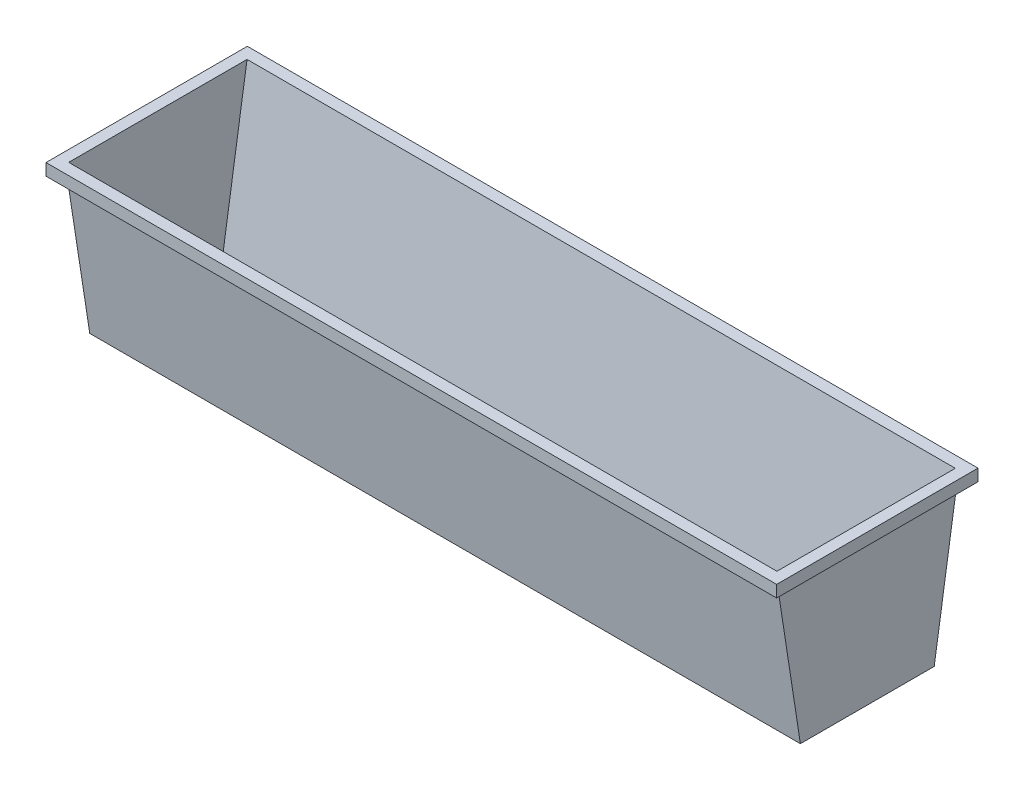
ISO-10303-21;
HEADER;
FILE_DESCRIPTION(('STEP AP214'),'2;1');
FILE_NAME('part.step','',(''),(''),'','','');
FILE_SCHEMA(('AUTOMOTIVE_DESIGN { 1 0 10303 214 1 1 1 1 }'));
ENDSEC;
DATA;
#1=APPLICATION_CONTEXT('core data for automotive mechanical design processes');
#2=APPLICATION_PROTOCOL_DEFINITION('international standard','automotive_design',2000,#1);
#3=PRODUCT_CONTEXT('',#1,'mechanical');
#4=PRODUCT('Part','Part','',(#3));
#5=PRODUCT_RELATED_PRODUCT_CATEGORY('part','',(#4));
#6=PRODUCT_DEFINITION_FORMATION('','',#4);
#7=PRODUCT_DEFINITION_CONTEXT('part definition',#1,'design');
#8=PRODUCT_DEFINITION('design','',#6,#7);
#9=PRODUCT_DEFINITION_SHAPE('','',#8);
#10=(LENGTH_UNIT() NAMED_UNIT(*) SI_UNIT(.MILLI.,.METRE.));
#11=(NAMED_UNIT(*) PLANE_ANGLE_UNIT() SI_UNIT($,.RADIAN.));
#12=(NAMED_UNIT(*) SI_UNIT($,.STERADIAN.) SOLID_ANGLE_UNIT());
#13=UNCERTAINTY_MEASURE_WITH_UNIT(LENGTH_MEASURE(1.E-05),#10,'distance_accuracy_value','');
#14=(GEOMETRIC_REPRESENTATION_CONTEXT(3) GLOBAL_UNCERTAINTY_ASSIGNED_CONTEXT((#13)) GLOBAL_UNIT_ASSIGNED_CONTEXT((#10,
#11,#12)) REPRESENTATION_CONTEXT('',''));
#15=CARTESIAN_POINT('',(0.,0.,0.));
#16=DIRECTION('',(0.,0.,1.));
#17=DIRECTION('',(1.,0.,0.));
#18=AXIS2_PLACEMENT_3D('',#15,#16,#17);
#19=CARTESIAN_POINT('',(0.,135.,0.));
#20=DIRECTION('',(0.,1.,0.));
#21=DIRECTION('',(0.,0.,1.));
#22=AXIS2_PLACEMENT_3D('',#19,#20,#21);
#23=PLANE('',#22);
#24=DIRECTION('',(1.,0.,0.));
#25=VECTOR('',#24,1.);
#26=CARTESIAN_POINT('',(-308.45833333,135.,28.4999999966667));
#27=LINE('',#26,#25);
#28=CARTESIAN_POINT('',(-308.45833333,135.,28.4999999966667));
#29=VERTEX_POINT('',#28);
#30=CARTESIAN_POINT('',(308.45833333,135.,28.4999999966667));
#31=VERTEX_POINT('',#30);
#32=EDGE_CURVE('E168',#29,#31,#27,.T.);
#33=ORIENTED_EDGE('',*,*,#32,.T.);
#34=DIRECTION('',(0.,0.,-1.));
#35=VECTOR('',#34,1.);
#36=CARTESIAN_POINT('',(308.45833333,135.,28.4999999966667));
#37=LINE('',#36,#35);
#38=CARTESIAN_POINT('',(308.45833333,135.,-141.499999996667));
#39=VERTEX_POINT('',#38);
#40=EDGE_CURVE('E171',#31,#39,#37,.T.);
#41=ORIENTED_EDGE('',*,*,#40,.T.);
#42=DIRECTION('',(-1.,0.,0.));
#43=VECTOR('',#42,1.);
#44=CARTESIAN_POINT('',(308.45833333,135.,-141.499999996667));
#45=LINE('',#44,#43);
#46=CARTESIAN_POINT('',(-308.45833333,135.,-141.499999996667));
#47=VERTEX_POINT('',#46);
#48=EDGE_CURVE('E174',#39,#47,#45,.T.);
#49=ORIENTED_EDGE('',*,*,#48,.T.);
#50=DIRECTION('',(0.,0.,1.));
#51=VECTOR('',#50,1.);
#52=CARTESIAN_POINT('',(-308.45833333,135.,-141.499999996667));
#53=LINE('',#52,#51);
#54=EDGE_CURVE('E176',#47,#29,#53,.T.);
#55=ORIENTED_EDGE('',*,*,#54,.T.);
#56=EDGE_LOOP('',(#33,#41,#49,#55));
#57=FACE_BOUND('',#56,.T.);
#58=DIRECTION('',(-1.,0.,0.));
#59=VECTOR('',#58,1.);
#60=CARTESIAN_POINT('',(299.,135.,-131.788872207039));
#61=LINE('',#60,#59);
#62=CARTESIAN_POINT('',(299.,135.,-131.788872207039));
#63=VERTEX_POINT('',#62);
#64=CARTESIAN_POINT('',(-299.,135.,-131.788872207039));
#65=VERTEX_POINT('',#64);
#66=EDGE_CURVE('E161',#63,#65,#61,.T.);
#67=ORIENTED_EDGE('',*,*,#66,.F.);
#68=DIRECTION('',(0.,0.,-1.));
#69=VECTOR('',#68,1.);
#70=CARTESIAN_POINT('',(299.,135.,-131.788872207039));
#71=LINE('',#70,#69);
#72=CARTESIAN_POINT('',(299.,135.,18.788872207039));
#73=VERTEX_POINT('',#72);
#74=EDGE_CURVE('E136',#73,#63,#71,.T.);
#75=ORIENTED_EDGE('',*,*,#74,.F.);
#76=DIRECTION('',(-1.,0.,0.));
#77=VECTOR('',#76,1.);
#78=CARTESIAN_POINT('',(299.,135.,18.788872207039));
#79=LINE('',#78,#77);
#80=CARTESIAN_POINT('',(-299.,135.,18.788872207039));
#81=VERTEX_POINT('',#80);
#82=EDGE_CURVE('E164',#73,#81,#79,.T.);
#83=ORIENTED_EDGE('',*,*,#82,.T.);
#84=DIRECTION('',(0.,0.,-1.));
#85=VECTOR('',#84,1.);
#86=CARTESIAN_POINT('',(-299.,135.,-131.788872207039));
#87=LINE('',#86,#85);
#88=EDGE_CURVE('E149',#81,#65,#87,.T.);
#89=ORIENTED_EDGE('',*,*,#88,.T.);
#90=EDGE_LOOP('',(#67,#75,#83,#89));
#91=FACE_BOUND('',#90,.T.);
#92=ADVANCED_FACE('F39',(#57,#91),#23,.T.);
#93=CARTESIAN_POINT('',(0.,125.,0.));
#94=DIRECTION('',(0.,1.,0.));
#95=DIRECTION('',(0.,0.,1.));
#96=AXIS2_PLACEMENT_3D('',#93,#94,#95);
#97=PLANE('',#96);
#98=DIRECTION('',(1.,0.,0.));
#99=VECTOR('',#98,1.);
#100=CARTESIAN_POINT('',(-308.45833333,125.,28.4999999966667));
#101=LINE('',#100,#99);
#102=CARTESIAN_POINT('',(-308.45833333,125.,28.4999999966667));
#103=VERTEX_POINT('',#102);
#104=CARTESIAN_POINT('',(308.45833333,125.,28.4999999966667));
#105=VERTEX_POINT('',#104);
#106=EDGE_CURVE('E163',#103,#105,#101,.T.);
#107=ORIENTED_EDGE('',*,*,#106,.F.);
#108=DIRECTION('',(0.,0.,1.));
#109=VECTOR('',#108,1.);
#110=CARTESIAN_POINT('',(-308.45833333,125.,-141.499999996667));
#111=LINE('',#110,#109);
#112=CARTESIAN_POINT('',(-308.45833333,125.,-141.499999996667));
#113=VERTEX_POINT('',#112);
#114=EDGE_CURVE('E172',#113,#103,#111,.T.);
#115=ORIENTED_EDGE('',*,*,#114,.F.);
#116=DIRECTION('',(-1.,0.,0.));
#117=VECTOR('',#116,1.);
#118=CARTESIAN_POINT('',(308.45833333,125.,-141.499999996667));
#119=LINE('',#118,#117);
#120=CARTESIAN_POINT('',(308.45833333,125.,-141.499999996667));
#121=VERTEX_POINT('',#120);
#122=EDGE_CURVE('E183',#121,#113,#119,.T.);
#123=ORIENTED_EDGE('',*,*,#122,.F.);
#124=DIRECTION('',(0.,0.,-1.));
#125=VECTOR('',#124,1.);
#126=CARTESIAN_POINT('',(308.45833333,125.,28.4999999966667));
#127=LINE('',#126,#125);
#128=EDGE_CURVE('E181',#105,#121,#127,.T.);
#129=ORIENTED_EDGE('',*,*,#128,.F.);
#130=EDGE_LOOP('',(#107,#115,#123,#129));
#131=FACE_BOUND('',#130,.T.);
#132=DIRECTION('',(-1.,0.,0.));
#133=VECTOR('',#132,1.);
#134=CARTESIAN_POINT('',(-300.,125.,-132.270833333333));
#135=LINE('',#134,#133);
#136=CARTESIAN_POINT('',(300.,125.,-132.270833333333));
#137=VERTEX_POINT('',#136);
#138=CARTESIAN_POINT('',(-300.,125.,-132.270833333333));
#139=VERTEX_POINT('',#138);
#140=EDGE_CURVE('E197',#137,#139,#135,.T.);
#141=ORIENTED_EDGE('',*,*,#140,.T.);
#142=DIRECTION('',(0.,0.,1.));
#143=VECTOR('',#142,1.);
#144=CARTESIAN_POINT('',(-300.,125.,0.));
#145=LINE('',#144,#143);
#146=CARTESIAN_POINT('',(-300.,125.,19.2708333333334));
#147=VERTEX_POINT('',#146);
#148=EDGE_CURVE('E200',#139,#147,#145,.T.);
#149=ORIENTED_EDGE('',*,*,#148,.T.);
#150=DIRECTION('',(-1.,0.,0.));
#151=VECTOR('',#150,1.);
#152=CARTESIAN_POINT('',(-300.,125.,19.2708333333334));
#153=LINE('',#152,#151);
#154=CARTESIAN_POINT('',(300.,125.,19.2708333333334));
#155=VERTEX_POINT('',#154);
#156=EDGE_CURVE('E62',#155,#147,#153,.T.);
#157=ORIENTED_EDGE('',*,*,#156,.F.);
#158=DIRECTION('',(0.,0.,1.));
#159=VECTOR('',#158,1.);
#160=CARTESIAN_POINT('',(300.,125.,0.));
#161=LINE('',#160,#159);
#162=EDGE_CURVE('E11',#137,#155,#161,.T.);
#163=ORIENTED_EDGE('',*,*,#162,.F.);
#164=EDGE_LOOP('',(#141,#149,#157,#163));
#165=FACE_BOUND('',#164,.T.);
#166=ADVANCED_FACE('F232',(#131,#165),#97,.F.);
#167=CARTESIAN_POINT('',(-308.45833333,135.,28.4999999966667));
#168=DIRECTION('',(0.,0.,-1.));
#169=DIRECTION('',(-1.,0.,0.));
#170=AXIS2_PLACEMENT_3D('',#167,#168,#169);
#171=PLANE('',#170);
#172=ORIENTED_EDGE('',*,*,#106,.T.);
#173=DIRECTION('',(0.,-1.,0.));
#174=VECTOR('',#173,1.);
#175=CARTESIAN_POINT('',(308.45833333,135.,28.4999999966667));
#176=LINE('',#175,#174);
#177=EDGE_CURVE('E194',#31,#105,#176,.T.);
#178=ORIENTED_EDGE('',*,*,#177,.F.);
#179=ORIENTED_EDGE('',*,*,#32,.F.);
#180=DIRECTION('',(0.,-1.,0.));
#181=VECTOR('',#180,1.);
#182=CARTESIAN_POINT('',(-308.45833333,135.,28.4999999966667));
#183=LINE('',#182,#181);
#184=EDGE_CURVE('E178',#29,#103,#183,.T.);
#185=ORIENTED_EDGE('',*,*,#184,.T.);
#186=EDGE_LOOP('',(#172,#178,#179,#185));
#187=FACE_BOUND('',#186,.T.);
#188=ADVANCED_FACE('F255',(#187),#171,.F.);
#189=CARTESIAN_POINT('',(308.45833333,135.,28.4999999966667));
#190=DIRECTION('',(-1.,0.,0.));
#191=DIRECTION('',(0.,0.,1.));
#192=AXIS2_PLACEMENT_3D('',#189,#190,#191);
#193=PLANE('',#192);
#194=ORIENTED_EDGE('',*,*,#128,.T.);
#195=DIRECTION('',(0.,-1.,0.));
#196=VECTOR('',#195,1.);
#197=CARTESIAN_POINT('',(308.45833333,135.,-141.499999996667));
#198=LINE('',#197,#196);
#199=EDGE_CURVE('E191',#39,#121,#198,.T.);
#200=ORIENTED_EDGE('',*,*,#199,.F.);
#201=ORIENTED_EDGE('',*,*,#40,.F.);
#202=ORIENTED_EDGE('',*,*,#177,.T.);
#203=EDGE_LOOP('',(#194,#200,#201,#202));
#204=FACE_BOUND('',#203,.T.);
#205=ADVANCED_FACE('F269',(#204),#193,.F.);
#206=CARTESIAN_POINT('',(308.45833333,135.,-141.499999996667));
#207=DIRECTION('',(0.,0.,1.));
#208=DIRECTION('',(1.,0.,0.));
#209=AXIS2_PLACEMENT_3D('',#206,#207,#208);
#210=PLANE('',#209);
#211=ORIENTED_EDGE('',*,*,#122,.T.);
#212=DIRECTION('',(0.,-1.,0.));
#213=VECTOR('',#212,1.);
#214=CARTESIAN_POINT('',(-308.45833333,135.,-141.499999996667));
#215=LINE('',#214,#213);
#216=EDGE_CURVE('E188',#47,#113,#215,.T.);
#217=ORIENTED_EDGE('',*,*,#216,.F.);
#218=ORIENTED_EDGE('',*,*,#48,.F.);
#219=ORIENTED_EDGE('',*,*,#199,.T.);
#220=EDGE_LOOP('',(#211,#217,#218,#219));
#221=FACE_BOUND('',#220,.T.);
#222=ADVANCED_FACE('F265',(#221),#210,.F.);
#223=CARTESIAN_POINT('',(-308.45833333,135.,-141.499999996667));
#224=DIRECTION('',(1.,0.,0.));
#225=DIRECTION('',(0.,0.,-1.));
#226=AXIS2_PLACEMENT_3D('',#223,#224,#225);
#227=PLANE('',#226);
#228=ORIENTED_EDGE('',*,*,#114,.T.);
#229=ORIENTED_EDGE('',*,*,#184,.F.);
#230=ORIENTED_EDGE('',*,*,#54,.F.);
#231=ORIENTED_EDGE('',*,*,#216,.T.);
#232=EDGE_LOOP('',(#228,#229,#230,#231));
#233=FACE_BOUND('',#232,.T.);
#234=ADVANCED_FACE('F262',(#233),#227,.F.);
#235=CARTESIAN_POINT('',(-300.,130.,20.0416666666667));
#236=DIRECTION('',(0.,-0.152366623153642,0.988324042077676));
#237=DIRECTION('',(0.,-0.988324042077676,-0.152366623153642));
#238=AXIS2_PLACEMENT_3D('',#235,#236,#237);
#239=PLANE('',#238);
#240=DIRECTION('',(0.,-0.988324042077676,-0.152366623153642));
#241=VECTOR('',#240,1.);
#242=CARTESIAN_POINT('',(300.,130.,20.0416666666667));
#243=LINE('',#242,#241);
#244=CARTESIAN_POINT('',(300.,0.,0.));
#245=VERTEX_POINT('',#244);
#246=EDGE_CURVE('E202',#155,#245,#243,.T.);
#247=ORIENTED_EDGE('',*,*,#246,.F.);
#248=ORIENTED_EDGE('',*,*,#156,.T.);
#249=DIRECTION('',(0.,-0.988324042077676,-0.152366623153642));
#250=VECTOR('',#249,1.);
#251=CARTESIAN_POINT('',(-300.,130.,20.0416666666667));
#252=LINE('',#251,#250);
#253=CARTESIAN_POINT('',(-300.,0.,0.));
#254=VERTEX_POINT('',#253);
#255=EDGE_CURVE('E203',#147,#254,#252,.T.);
#256=ORIENTED_EDGE('',*,*,#255,.T.);
#257=DIRECTION('',(1.,0.,0.));
#258=VECTOR('',#257,1.);
#259=CARTESIAN_POINT('',(-300.,0.,0.));
#260=LINE('',#259,#258);
#261=EDGE_CURVE('E211',#254,#245,#260,.T.);
#262=ORIENTED_EDGE('',*,*,#261,.T.);
#263=EDGE_LOOP('',(#247,#248,#256,#262));
#264=FACE_BOUND('',#263,.T.);
#265=ADVANCED_FACE('F41',(#264),#239,.T.);
#266=CARTESIAN_POINT('',(-300.,130.,-133.041666666667));
#267=DIRECTION('',(0.,0.152366623153642,0.988324042077676));
#268=DIRECTION('',(0.,-0.988324042077676,0.152366623153642));
#269=AXIS2_PLACEMENT_3D('',#266,#267,#268);
#270=PLANE('',#269);
#271=ORIENTED_EDGE('',*,*,#140,.F.);
#272=DIRECTION('',(0.,-0.988324042077676,0.152366623153642));
#273=VECTOR('',#272,1.);
#274=CARTESIAN_POINT('',(300.,130.,-133.041666666667));
#275=LINE('',#274,#273);
#276=CARTESIAN_POINT('',(300.,0.,-113.));
#277=VERTEX_POINT('',#276);
#278=EDGE_CURVE('E206',#137,#277,#275,.T.);
#279=ORIENTED_EDGE('',*,*,#278,.T.);
#280=DIRECTION('',(1.,0.,0.));
#281=VECTOR('',#280,1.);
#282=CARTESIAN_POINT('',(-300.,0.,-113.));
#283=LINE('',#282,#281);
#284=CARTESIAN_POINT('',(-300.,0.,-113.));
#285=VERTEX_POINT('',#284);
#286=EDGE_CURVE('E47',#285,#277,#283,.T.);
#287=ORIENTED_EDGE('',*,*,#286,.F.);
#288=DIRECTION('',(0.,-0.988324042077676,0.152366623153642));
#289=VECTOR('',#288,1.);
#290=CARTESIAN_POINT('',(-300.,130.,-133.041666666667));
#291=LINE('',#290,#289);
#292=EDGE_CURVE('E209',#139,#285,#291,.T.);
#293=ORIENTED_EDGE('',*,*,#292,.F.);
#294=EDGE_LOOP('',(#271,#279,#287,#293));
#295=FACE_BOUND('',#294,.T.);
#296=ADVANCED_FACE('F236',(#295),#270,.F.);
#297=CARTESIAN_POINT('',(-300.,0.,0.));
#298=DIRECTION('',(1.,0.,0.));
#299=DIRECTION('',(0.,0.,-1.));
#300=AXIS2_PLACEMENT_3D('',#297,#298,#299);
#301=PLANE('',#300);
#302=ORIENTED_EDGE('',*,*,#148,.F.);
#303=ORIENTED_EDGE('',*,*,#292,.T.);
#304=DIRECTION('',(0.,0.,-1.));
#305=VECTOR('',#304,1.);
#306=CARTESIAN_POINT('',(-300.,0.,0.));
#307=LINE('',#306,#305);
#308=EDGE_CURVE('E205',#254,#285,#307,.T.);
#309=ORIENTED_EDGE('',*,*,#308,.F.);
#310=ORIENTED_EDGE('',*,*,#255,.F.);
#311=EDGE_LOOP('',(#302,#303,#309,#310));
#312=FACE_BOUND('',#311,.T.);
#313=ADVANCED_FACE('F238',(#312),#301,.F.);
#314=CARTESIAN_POINT('',(300.,0.,0.));
#315=DIRECTION('',(1.,0.,0.));
#316=DIRECTION('',(0.,0.,-1.));
#317=AXIS2_PLACEMENT_3D('',#314,#315,#316);
#318=PLANE('',#317);
#319=ORIENTED_EDGE('',*,*,#278,.F.);
#320=ORIENTED_EDGE('',*,*,#162,.T.);
#321=ORIENTED_EDGE('',*,*,#246,.T.);
#322=DIRECTION('',(0.,0.,-1.));
#323=VECTOR('',#322,1.);
#324=CARTESIAN_POINT('',(300.,0.,0.));
#325=LINE('',#324,#323);
#326=EDGE_CURVE('E213',#245,#277,#325,.T.);
#327=ORIENTED_EDGE('',*,*,#326,.T.);
#328=EDGE_LOOP('',(#319,#320,#321,#327));
#329=FACE_BOUND('',#328,.T.);
#330=ADVANCED_FACE('F230',(#329),#318,.T.);
#331=CARTESIAN_POINT('',(-300.,0.,0.));
#332=DIRECTION('',(0.,-1.,0.));
#333=DIRECTION('',(0.,0.,-1.));
#334=AXIS2_PLACEMENT_3D('',#331,#332,#333);
#335=PLANE('',#334);
#336=ORIENTED_EDGE('',*,*,#326,.F.);
#337=ORIENTED_EDGE('',*,*,#261,.F.);
#338=ORIENTED_EDGE('',*,*,#308,.T.);
#339=ORIENTED_EDGE('',*,*,#286,.T.);
#340=EDGE_LOOP('',(#336,#337,#338,#339));
#341=FACE_BOUND('',#340,.T.);
#342=ADVANCED_FACE('F226',(#341),#335,.T.);
#343=CARTESIAN_POINT('',(299.,135.,-131.788872207039));
#344=DIRECTION('',(0.,-0.152366623153642,-0.988324042077676));
#345=DIRECTION('',(0.,0.988324042077676,-0.152366623153642));
#346=AXIS2_PLACEMENT_3D('',#343,#344,#345);
#347=PLANE('',#346);
#348=DIRECTION('',(0.,-0.988324042077676,0.152366623153642));
#349=VECTOR('',#348,1.);
#350=CARTESIAN_POINT('',(-299.,135.,-131.788872207039));
#351=LINE('',#350,#349);
#352=CARTESIAN_POINT('',(-299.,2.,-111.284705540372));
#353=VERTEX_POINT('',#352);
#354=EDGE_CURVE('E54',#65,#353,#351,.T.);
#355=ORIENTED_EDGE('',*,*,#354,.T.);
#356=DIRECTION('',(-1.,0.,0.));
#357=VECTOR('',#356,1.);
#358=CARTESIAN_POINT('',(299.,2.,-111.284705540372));
#359=LINE('',#358,#357);
#360=CARTESIAN_POINT('',(299.,2.,-111.284705540372));
#361=VERTEX_POINT('',#360);
#362=EDGE_CURVE('E127',#361,#353,#359,.T.);
#363=ORIENTED_EDGE('',*,*,#362,.F.);
#364=DIRECTION('',(0.,-0.988324042077676,0.152366623153642));
#365=VECTOR('',#364,1.);
#366=CARTESIAN_POINT('',(299.,135.,-131.788872207039));
#367=LINE('',#366,#365);
#368=EDGE_CURVE('E131',#63,#361,#367,.T.);
#369=ORIENTED_EDGE('',*,*,#368,.F.);
#370=ORIENTED_EDGE('',*,*,#66,.T.);
#371=EDGE_LOOP('',(#355,#363,#369,#370));
#372=FACE_BOUND('',#371,.T.);
#373=ADVANCED_FACE('F129',(#372),#347,.F.);
#374=CARTESIAN_POINT('',(299.,1.99999999999998,-1.71529445962773));
#375=DIRECTION('',(0.,-0.152366623153642,0.988324042077676));
#376=DIRECTION('',(0.,-0.988324042077676,-0.152366623153642));
#377=AXIS2_PLACEMENT_3D('',#374,#375,#376);
#378=PLANE('',#377);
#379=DIRECTION('',(0.,0.988324042077676,0.152366623153642));
#380=VECTOR('',#379,1.);
#381=CARTESIAN_POINT('',(-299.,1.99999999999998,-1.71529445962773));
#382=LINE('',#381,#380);
#383=CARTESIAN_POINT('',(-299.,1.99999999999998,-1.71529445962773));
#384=VERTEX_POINT('',#383);
#385=EDGE_CURVE('E152',#384,#81,#382,.T.);
#386=ORIENTED_EDGE('',*,*,#385,.T.);
#387=ORIENTED_EDGE('',*,*,#82,.F.);
#388=DIRECTION('',(0.,0.988324042077676,0.152366623153642));
#389=VECTOR('',#388,1.);
#390=CARTESIAN_POINT('',(299.,1.99999999999998,-1.71529445962773));
#391=LINE('',#390,#389);
#392=CARTESIAN_POINT('',(299.,1.99999999999998,-1.71529445962773));
#393=VERTEX_POINT('',#392);
#394=EDGE_CURVE('E144',#393,#73,#391,.T.);
#395=ORIENTED_EDGE('',*,*,#394,.F.);
#396=DIRECTION('',(-1.,0.,0.));
#397=VECTOR('',#396,1.);
#398=CARTESIAN_POINT('',(299.,1.99999999999998,-1.71529445962773));
#399=LINE('',#398,#397);
#400=EDGE_CURVE('E135',#393,#384,#399,.T.);
#401=ORIENTED_EDGE('',*,*,#400,.T.);
#402=EDGE_LOOP('',(#386,#387,#395,#401));
#403=FACE_BOUND('',#402,.T.);
#404=ADVANCED_FACE('F337',(#403),#378,.F.);
#405=CARTESIAN_POINT('',(299.,2.,-111.284705540372));
#406=DIRECTION('',(0.,-1.,0.));
#407=DIRECTION('',(0.,0.,-1.));
#408=AXIS2_PLACEMENT_3D('',#405,#406,#407);
#409=PLANE('',#408);
#410=DIRECTION('',(0.,0.,1.));
#411=VECTOR('',#410,1.);
#412=CARTESIAN_POINT('',(-299.,2.,-111.284705540372));
#413=LINE('',#412,#411);
#414=EDGE_CURVE('E158',#353,#384,#413,.T.);
#415=ORIENTED_EDGE('',*,*,#414,.T.);
#416=ORIENTED_EDGE('',*,*,#400,.F.);
#417=DIRECTION('',(0.,0.,1.));
#418=VECTOR('',#417,1.);
#419=CARTESIAN_POINT('',(299.,2.,-111.284705540372));
#420=LINE('',#419,#418);
#421=EDGE_CURVE('E139',#361,#393,#420,.T.);
#422=ORIENTED_EDGE('',*,*,#421,.F.);
#423=ORIENTED_EDGE('',*,*,#362,.T.);
#424=EDGE_LOOP('',(#415,#416,#422,#423));
#425=FACE_BOUND('',#424,.T.);
#426=ADVANCED_FACE('F140',(#425),#409,.F.);
#427=CARTESIAN_POINT('',(299.,0.,0.));
#428=DIRECTION('',(-1.,0.,0.));
#429=DIRECTION('',(0.,0.,1.));
#430=AXIS2_PLACEMENT_3D('',#427,#428,#429);
#431=PLANE('',#430);
#432=ORIENTED_EDGE('',*,*,#368,.T.);
#433=ORIENTED_EDGE('',*,*,#421,.T.);
#434=ORIENTED_EDGE('',*,*,#394,.T.);
#435=ORIENTED_EDGE('',*,*,#74,.T.);
#436=EDGE_LOOP('',(#432,#433,#434,#435));
#437=FACE_BOUND('',#436,.T.);
#438=ADVANCED_FACE('F146',(#437),#431,.T.);
#439=CARTESIAN_POINT('',(-299.,0.,0.));
#440=DIRECTION('',(-1.,0.,0.));
#441=DIRECTION('',(0.,0.,1.));
#442=AXIS2_PLACEMENT_3D('',#439,#440,#441);
#443=PLANE('',#442);
#444=ORIENTED_EDGE('',*,*,#354,.F.);
#445=ORIENTED_EDGE('',*,*,#88,.F.);
#446=ORIENTED_EDGE('',*,*,#385,.F.);
#447=ORIENTED_EDGE('',*,*,#414,.F.);
#448=EDGE_LOOP('',(#444,#445,#446,#447));
#449=FACE_BOUND('',#448,.T.);
#450=ADVANCED_FACE('F347',(#449),#443,.F.);
#451=CLOSED_SHELL('',(#92,#166,#188,#205,#222,#234,#265,#296,#313,#330,#342,#373,#404,#426,#438,#450));
#452=MANIFOLD_SOLID_BREP('B2',#451);
#453=ADVANCED_BREP_SHAPE_REPRESENTATION('',(#18,#452),#14);
#454=SHAPE_DEFINITION_REPRESENTATION(#9,#453);
ENDSEC;
END-ISO-10303-21;
